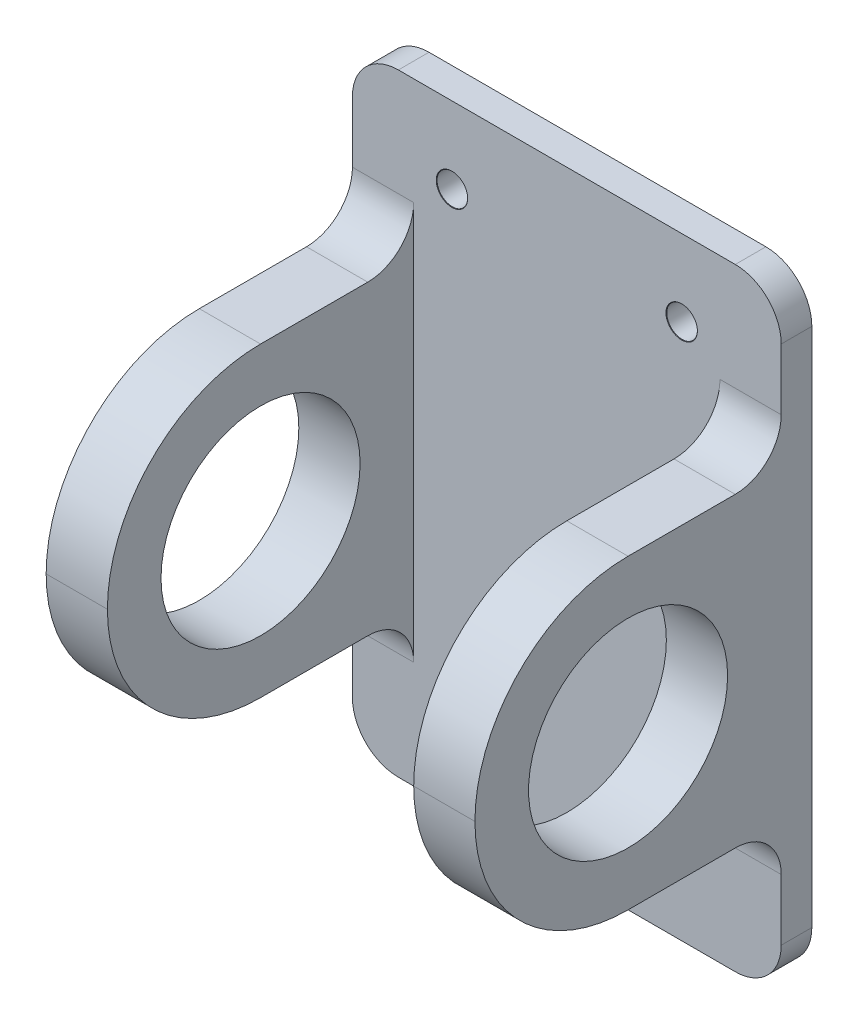
ISO-10303-21;
HEADER;
FILE_DESCRIPTION(('STEP AP214'),'2;1');
FILE_NAME('part.step','',(''),(''),'','','');
FILE_SCHEMA(('AUTOMOTIVE_DESIGN { 1 0 10303 214 1 1 1 1 }'));
ENDSEC;
DATA;
#1=APPLICATION_CONTEXT('core data for automotive mechanical design processes');
#2=APPLICATION_PROTOCOL_DEFINITION('international standard','automotive_design',2000,#1);
#3=PRODUCT_CONTEXT('',#1,'mechanical');
#4=PRODUCT('Part','Part','',(#3));
#5=PRODUCT_RELATED_PRODUCT_CATEGORY('part','',(#4));
#6=PRODUCT_DEFINITION_FORMATION('','',#4);
#7=PRODUCT_DEFINITION_CONTEXT('part definition',#1,'design');
#8=PRODUCT_DEFINITION('design','',#6,#7);
#9=PRODUCT_DEFINITION_SHAPE('','',#8);
#10=(LENGTH_UNIT() NAMED_UNIT(*) SI_UNIT(.MILLI.,.METRE.));
#11=(NAMED_UNIT(*) PLANE_ANGLE_UNIT() SI_UNIT($,.RADIAN.));
#12=(NAMED_UNIT(*) SI_UNIT($,.STERADIAN.) SOLID_ANGLE_UNIT());
#13=UNCERTAINTY_MEASURE_WITH_UNIT(LENGTH_MEASURE(1.E-05),#10,'distance_accuracy_value','');
#14=(GEOMETRIC_REPRESENTATION_CONTEXT(3) GLOBAL_UNCERTAINTY_ASSIGNED_CONTEXT((#13)) GLOBAL_UNIT_ASSIGNED_CONTEXT((#10,
#11,#12)) REPRESENTATION_CONTEXT('',''));
#15=CARTESIAN_POINT('',(0.,0.,0.));
#16=DIRECTION('',(0.,0.,1.));
#17=DIRECTION('',(1.,0.,0.));
#18=AXIS2_PLACEMENT_3D('',#15,#16,#17);
#19=CARTESIAN_POINT('',(0.,0.,0.));
#20=DIRECTION('',(0.,0.,1.));
#21=DIRECTION('',(1.,0.,0.));
#22=AXIS2_PLACEMENT_3D('',#19,#20,#21);
#23=PLANE('',#22);
#24=CARTESIAN_POINT('',(-7.5,-15.,0.));
#25=DIRECTION('',(0.,0.,1.));
#26=DIRECTION('',(1.,0.,0.));
#27=AXIS2_PLACEMENT_3D('',#24,#25,#26);
#28=CIRCLE('',#27,1.025);
#29=CARTESIAN_POINT('',(-6.475,-15.,0.));
#30=VERTEX_POINT('',#29);
#31=EDGE_CURVE('E411',#30,#30,#28,.T.);
#32=ORIENTED_EDGE('',*,*,#31,.F.);
#33=EDGE_LOOP('',(#32));
#34=FACE_BOUND('',#33,.T.);
#35=CARTESIAN_POINT('',(7.5,-15.,0.));
#36=DIRECTION('',(0.,0.,1.));
#37=DIRECTION('',(1.,0.,0.));
#38=AXIS2_PLACEMENT_3D('',#35,#36,#37);
#39=CIRCLE('',#38,1.025);
#40=CARTESIAN_POINT('',(8.525,-15.,0.));
#41=VERTEX_POINT('',#40);
#42=EDGE_CURVE('E407',#41,#41,#39,.T.);
#43=ORIENTED_EDGE('',*,*,#42,.F.);
#44=EDGE_LOOP('',(#43));
#45=FACE_BOUND('',#44,.T.);
#46=CARTESIAN_POINT('',(-7.5,15.,0.));
#47=DIRECTION('',(0.,0.,1.));
#48=DIRECTION('',(1.,0.,0.));
#49=AXIS2_PLACEMENT_3D('',#46,#47,#48);
#50=CIRCLE('',#49,1.025);
#51=CARTESIAN_POINT('',(-6.475,15.,0.));
#52=VERTEX_POINT('',#51);
#53=EDGE_CURVE('E400',#52,#52,#50,.T.);
#54=ORIENTED_EDGE('',*,*,#53,.F.);
#55=EDGE_LOOP('',(#54));
#56=FACE_BOUND('',#55,.T.);
#57=CARTESIAN_POINT('',(7.5,15.,0.));
#58=DIRECTION('',(0.,0.,1.));
#59=DIRECTION('',(1.,0.,0.));
#60=AXIS2_PLACEMENT_3D('',#57,#58,#59);
#61=CIRCLE('',#60,1.025);
#62=CARTESIAN_POINT('',(8.525,15.,0.));
#63=VERTEX_POINT('',#62);
#64=EDGE_CURVE('E389',#63,#63,#61,.T.);
#65=ORIENTED_EDGE('',*,*,#64,.F.);
#66=EDGE_LOOP('',(#65));
#67=FACE_BOUND('',#66,.T.);
#68=DIRECTION('',(0.,-1.,0.));
#69=VECTOR('',#68,1.);
#70=CARTESIAN_POINT('',(-14.,-20.,0.));
#71=LINE('',#70,#69);
#72=CARTESIAN_POINT('',(-14.,-13.,0.));
#73=VERTEX_POINT('',#72);
#74=CARTESIAN_POINT('',(-14.,-17.,0.));
#75=VERTEX_POINT('',#74);
#76=EDGE_CURVE('E224',#73,#75,#71,.T.);
#77=ORIENTED_EDGE('',*,*,#76,.T.);
#78=CARTESIAN_POINT('',(-11.,-17.,0.));
#79=DIRECTION('',(0.,0.,1.));
#80=DIRECTION('',(1.,0.,0.));
#81=AXIS2_PLACEMENT_3D('',#78,#79,#80);
#82=CIRCLE('',#81,3.);
#83=CARTESIAN_POINT('',(-11.,-20.,0.));
#84=VERTEX_POINT('',#83);
#85=EDGE_CURVE('E277',#75,#84,#82,.T.);
#86=ORIENTED_EDGE('',*,*,#85,.T.);
#87=DIRECTION('',(1.,0.,0.));
#88=VECTOR('',#87,1.);
#89=CARTESIAN_POINT('',(-14.,-20.,0.));
#90=LINE('',#89,#88);
#91=CARTESIAN_POINT('',(11.,-20.,0.));
#92=VERTEX_POINT('',#91);
#93=EDGE_CURVE('E347',#84,#92,#90,.T.);
#94=ORIENTED_EDGE('',*,*,#93,.T.);
#95=CARTESIAN_POINT('',(11.,-17.,0.));
#96=DIRECTION('',(0.,0.,1.));
#97=DIRECTION('',(1.,0.,0.));
#98=AXIS2_PLACEMENT_3D('',#95,#96,#97);
#99=CIRCLE('',#98,3.);
#100=CARTESIAN_POINT('',(14.,-17.,0.));
#101=VERTEX_POINT('',#100);
#102=EDGE_CURVE('E269',#92,#101,#99,.T.);
#103=ORIENTED_EDGE('',*,*,#102,.T.);
#104=DIRECTION('',(0.,1.,0.));
#105=VECTOR('',#104,1.);
#106=CARTESIAN_POINT('',(14.,-20.,0.));
#107=LINE('',#106,#105);
#108=CARTESIAN_POINT('',(14.,-13.,0.));
#109=VERTEX_POINT('',#108);
#110=EDGE_CURVE('E342',#101,#109,#107,.T.);
#111=ORIENTED_EDGE('',*,*,#110,.T.);
#112=DIRECTION('',(1.,0.,0.));
#113=VECTOR('',#112,1.);
#114=CARTESIAN_POINT('',(0.,-13.,0.));
#115=LINE('',#114,#113);
#116=CARTESIAN_POINT('',(9.99999999999999,-13.,0.));
#117=VERTEX_POINT('',#116);
#118=EDGE_CURVE('E263',#109,#117,#115,.F.);
#119=ORIENTED_EDGE('',*,*,#118,.T.);
#120=DIRECTION('',(0.,1.,0.));
#121=VECTOR('',#120,1.);
#122=CARTESIAN_POINT('',(9.99999999999999,0.,0.));
#123=LINE('',#122,#121);
#124=CARTESIAN_POINT('',(9.99999999999999,13.,0.));
#125=VERTEX_POINT('',#124);
#126=EDGE_CURVE('E214',#117,#125,#123,.T.);
#127=ORIENTED_EDGE('',*,*,#126,.T.);
#128=DIRECTION('',(1.,0.,0.));
#129=VECTOR('',#128,1.);
#130=CARTESIAN_POINT('',(14.,13.,0.));
#131=LINE('',#130,#129);
#132=CARTESIAN_POINT('',(14.,13.,0.));
#133=VERTEX_POINT('',#132);
#134=EDGE_CURVE('E270',#125,#133,#131,.T.);
#135=ORIENTED_EDGE('',*,*,#134,.T.);
#136=CARTESIAN_POINT('',(14.,17.,0.));
#137=VERTEX_POINT('',#136);
#138=EDGE_CURVE('E341',#133,#137,#107,.T.);
#139=ORIENTED_EDGE('',*,*,#138,.T.);
#140=CARTESIAN_POINT('',(11.,17.,0.));
#141=DIRECTION('',(0.,0.,1.));
#142=DIRECTION('',(1.,0.,0.));
#143=AXIS2_PLACEMENT_3D('',#140,#141,#142);
#144=CIRCLE('',#143,3.);
#145=CARTESIAN_POINT('',(11.,20.,0.));
#146=VERTEX_POINT('',#145);
#147=EDGE_CURVE('E275',#137,#146,#144,.T.);
#148=ORIENTED_EDGE('',*,*,#147,.T.);
#149=DIRECTION('',(-1.,0.,0.));
#150=VECTOR('',#149,1.);
#151=CARTESIAN_POINT('',(-14.,20.,0.));
#152=LINE('',#151,#150);
#153=CARTESIAN_POINT('',(-11.,20.,0.));
#154=VERTEX_POINT('',#153);
#155=EDGE_CURVE('E340',#146,#154,#152,.T.);
#156=ORIENTED_EDGE('',*,*,#155,.T.);
#157=CARTESIAN_POINT('',(-11.,17.,0.));
#158=DIRECTION('',(0.,0.,1.));
#159=DIRECTION('',(1.,0.,0.));
#160=AXIS2_PLACEMENT_3D('',#157,#158,#159);
#161=CIRCLE('',#160,3.);
#162=CARTESIAN_POINT('',(-14.,17.,0.));
#163=VERTEX_POINT('',#162);
#164=EDGE_CURVE('E274',#154,#163,#161,.T.);
#165=ORIENTED_EDGE('',*,*,#164,.T.);
#166=CARTESIAN_POINT('',(-14.,13.,0.));
#167=VERTEX_POINT('',#166);
#168=EDGE_CURVE('E337',#163,#167,#71,.T.);
#169=ORIENTED_EDGE('',*,*,#168,.T.);
#170=DIRECTION('',(1.,0.,0.));
#171=VECTOR('',#170,1.);
#172=CARTESIAN_POINT('',(-10.,13.,0.));
#173=LINE('',#172,#171);
#174=CARTESIAN_POINT('',(-10.,13.,0.));
#175=VERTEX_POINT('',#174);
#176=EDGE_CURVE('E265',#167,#175,#173,.T.);
#177=ORIENTED_EDGE('',*,*,#176,.T.);
#178=DIRECTION('',(0.,1.,0.));
#179=VECTOR('',#178,1.);
#180=CARTESIAN_POINT('',(-10.,0.,0.));
#181=LINE('',#180,#179);
#182=CARTESIAN_POINT('',(-10.,-13.,0.));
#183=VERTEX_POINT('',#182);
#184=EDGE_CURVE('E324',#183,#175,#181,.T.);
#185=ORIENTED_EDGE('',*,*,#184,.F.);
#186=DIRECTION('',(1.,0.,0.));
#187=VECTOR('',#186,1.);
#188=CARTESIAN_POINT('',(0.,-13.,0.));
#189=LINE('',#188,#187);
#190=EDGE_CURVE('E256',#183,#73,#189,.F.);
#191=ORIENTED_EDGE('',*,*,#190,.T.);
#192=EDGE_LOOP('',(#77,#86,#94,#103,#111,#119,#127,#135,#139,#148,#156,#165,#169,#177,#185,#191));
#193=FACE_BOUND('',#192,.T.);
#194=ADVANCED_FACE('F41',(#34,#45,#56,#67,#193),#23,.T.);
#195=CARTESIAN_POINT('',(-14.,-20.,-2.));
#196=DIRECTION('',(0.,-1.,0.));
#197=DIRECTION('',(0.,0.,-1.));
#198=AXIS2_PLACEMENT_3D('',#195,#196,#197);
#199=PLANE('',#198);
#200=ORIENTED_EDGE('',*,*,#93,.F.);
#201=DIRECTION('',(0.,0.,1.));
#202=VECTOR('',#201,1.);
#203=CARTESIAN_POINT('',(-11.,-20.,-2.));
#204=LINE('',#203,#202);
#205=CARTESIAN_POINT('',(-11.,-20.,-2.));
#206=VERTEX_POINT('',#205);
#207=EDGE_CURVE('E283',#84,#206,#204,.F.);
#208=ORIENTED_EDGE('',*,*,#207,.T.);
#209=DIRECTION('',(1.,0.,0.));
#210=VECTOR('',#209,1.);
#211=CARTESIAN_POINT('',(-14.,-20.,-2.));
#212=LINE('',#211,#210);
#213=CARTESIAN_POINT('',(11.,-20.,-2.));
#214=VERTEX_POINT('',#213);
#215=EDGE_CURVE('E339',#206,#214,#212,.T.);
#216=ORIENTED_EDGE('',*,*,#215,.T.);
#217=DIRECTION('',(0.,0.,1.));
#218=VECTOR('',#217,1.);
#219=CARTESIAN_POINT('',(11.,-20.,-2.));
#220=LINE('',#219,#218);
#221=EDGE_CURVE('E279',#214,#92,#220,.T.);
#222=ORIENTED_EDGE('',*,*,#221,.T.);
#223=EDGE_LOOP('',(#200,#208,#216,#222));
#224=FACE_BOUND('',#223,.T.);
#225=ADVANCED_FACE('F421',(#224),#199,.T.);
#226=CARTESIAN_POINT('',(-14.,-20.,-2.));
#227=DIRECTION('',(-1.,0.,0.));
#228=DIRECTION('',(0.,-1.,0.));
#229=AXIS2_PLACEMENT_3D('',#226,#227,#228);
#230=PLANE('',#229);
#231=CARTESIAN_POINT('',(-14.,0.,10.));
#232=DIRECTION('',(1.,0.,0.));
#233=DIRECTION('',(0.,0.,-1.));
#234=AXIS2_PLACEMENT_3D('',#231,#232,#233);
#235=CIRCLE('',#234,6.49999999999999);
#236=CARTESIAN_POINT('',(-14.,0.,3.50000000000001));
#237=VERTEX_POINT('',#236);
#238=EDGE_CURVE('E251',#237,#237,#235,.T.);
#239=ORIENTED_EDGE('',*,*,#238,.T.);
#240=EDGE_LOOP('',(#239));
#241=FACE_BOUND('',#240,.T.);
#242=DIRECTION('',(0.,-1.,0.));
#243=VECTOR('',#242,1.);
#244=CARTESIAN_POINT('',(-14.,-20.,-2.));
#245=LINE('',#244,#243);
#246=CARTESIAN_POINT('',(-14.,17.,-2.));
#247=VERTEX_POINT('',#246);
#248=CARTESIAN_POINT('',(-14.,-17.,-2.));
#249=VERTEX_POINT('',#248);
#250=EDGE_CURVE('E217',#247,#249,#245,.T.);
#251=ORIENTED_EDGE('',*,*,#250,.T.);
#252=DIRECTION('',(0.,0.,1.));
#253=VECTOR('',#252,1.);
#254=CARTESIAN_POINT('',(-14.,-17.,-2.));
#255=LINE('',#254,#253);
#256=EDGE_CURVE('E257',#249,#75,#255,.T.);
#257=ORIENTED_EDGE('',*,*,#256,.T.);
#258=ORIENTED_EDGE('',*,*,#76,.F.);
#259=CARTESIAN_POINT('',(-14.,-13.,3.));
#260=DIRECTION('',(-1.,0.,0.));
#261=DIRECTION('',(0.,-1.,0.));
#262=AXIS2_PLACEMENT_3D('',#259,#260,#261);
#263=CIRCLE('',#262,3.);
#264=CARTESIAN_POINT('',(-14.,-10.,3.));
#265=VERTEX_POINT('',#264);
#266=EDGE_CURVE('E11',#73,#265,#263,.F.);
#267=ORIENTED_EDGE('',*,*,#266,.T.);
#268=DIRECTION('',(0.,0.,-1.));
#269=VECTOR('',#268,1.);
#270=CARTESIAN_POINT('',(-14.,-10.,20.));
#271=LINE('',#270,#269);
#272=CARTESIAN_POINT('',(-14.,-10.,10.));
#273=VERTEX_POINT('',#272);
#274=EDGE_CURVE('E375',#273,#265,#271,.T.);
#275=ORIENTED_EDGE('',*,*,#274,.F.);
#276=CARTESIAN_POINT('',(-14.,0.,10.));
#277=DIRECTION('',(-1.,0.,0.));
#278=DIRECTION('',(0.,-1.,0.));
#279=AXIS2_PLACEMENT_3D('',#276,#277,#278);
#280=CIRCLE('',#279,10.);
#281=CARTESIAN_POINT('',(-14.,0.,20.));
#282=VERTEX_POINT('',#281);
#283=EDGE_CURVE('E238',#273,#282,#280,.T.);
#284=ORIENTED_EDGE('',*,*,#283,.T.);
#285=CARTESIAN_POINT('',(-14.,0.,10.));
#286=DIRECTION('',(-1.,0.,0.));
#287=DIRECTION('',(0.,-1.,0.));
#288=AXIS2_PLACEMENT_3D('',#285,#286,#287);
#289=CIRCLE('',#288,10.);
#290=CARTESIAN_POINT('',(-14.,10.,10.));
#291=VERTEX_POINT('',#290);
#292=EDGE_CURVE('E239',#282,#291,#289,.T.);
#293=ORIENTED_EDGE('',*,*,#292,.T.);
#294=DIRECTION('',(0.,0.,-1.));
#295=VECTOR('',#294,1.);
#296=CARTESIAN_POINT('',(-14.,10.,20.));
#297=LINE('',#296,#295);
#298=CARTESIAN_POINT('',(-14.,10.,3.));
#299=VERTEX_POINT('',#298);
#300=EDGE_CURVE('E367',#291,#299,#297,.T.);
#301=ORIENTED_EDGE('',*,*,#300,.T.);
#302=CARTESIAN_POINT('',(-14.,13.,3.));
#303=DIRECTION('',(-1.,0.,0.));
#304=DIRECTION('',(0.,-1.,0.));
#305=AXIS2_PLACEMENT_3D('',#302,#303,#304);
#306=CIRCLE('',#305,3.);
#307=EDGE_CURVE('E314',#299,#167,#306,.F.);
#308=ORIENTED_EDGE('',*,*,#307,.T.);
#309=ORIENTED_EDGE('',*,*,#168,.F.);
#310=DIRECTION('',(0.,0.,1.));
#311=VECTOR('',#310,1.);
#312=CARTESIAN_POINT('',(-14.,17.,-2.));
#313=LINE('',#312,#311);
#314=EDGE_CURVE('E242',#163,#247,#313,.F.);
#315=ORIENTED_EDGE('',*,*,#314,.T.);
#316=EDGE_LOOP('',(#251,#257,#258,#267,#275,#284,#293,#301,#308,#309,#315));
#317=FACE_BOUND('',#316,.T.);
#318=ADVANCED_FACE('F335',(#241,#317),#230,.T.);
#319=CARTESIAN_POINT('',(-14.,20.,-2.));
#320=DIRECTION('',(0.,1.,0.));
#321=DIRECTION('',(0.,0.,1.));
#322=AXIS2_PLACEMENT_3D('',#319,#320,#321);
#323=PLANE('',#322);
#324=DIRECTION('',(-1.,0.,0.));
#325=VECTOR('',#324,1.);
#326=CARTESIAN_POINT('',(-14.,20.,-2.));
#327=LINE('',#326,#325);
#328=CARTESIAN_POINT('',(11.,20.,-2.));
#329=VERTEX_POINT('',#328);
#330=CARTESIAN_POINT('',(-11.,20.,-2.));
#331=VERTEX_POINT('',#330);
#332=EDGE_CURVE('E225',#329,#331,#327,.T.);
#333=ORIENTED_EDGE('',*,*,#332,.T.);
#334=DIRECTION('',(0.,0.,1.));
#335=VECTOR('',#334,1.);
#336=CARTESIAN_POINT('',(-11.,20.,-2.));
#337=LINE('',#336,#335);
#338=EDGE_CURVE('E291',#331,#154,#337,.T.);
#339=ORIENTED_EDGE('',*,*,#338,.T.);
#340=ORIENTED_EDGE('',*,*,#155,.F.);
#341=DIRECTION('',(0.,0.,1.));
#342=VECTOR('',#341,1.);
#343=CARTESIAN_POINT('',(11.,20.,-2.));
#344=LINE('',#343,#342);
#345=EDGE_CURVE('E293',#146,#329,#344,.F.);
#346=ORIENTED_EDGE('',*,*,#345,.T.);
#347=EDGE_LOOP('',(#333,#339,#340,#346));
#348=FACE_BOUND('',#347,.T.);
#349=ADVANCED_FACE('F485',(#348),#323,.T.);
#350=CARTESIAN_POINT('',(14.,-20.,-2.));
#351=DIRECTION('',(1.,0.,0.));
#352=DIRECTION('',(0.,1.,0.));
#353=AXIS2_PLACEMENT_3D('',#350,#351,#352);
#354=PLANE('',#353);
#355=CARTESIAN_POINT('',(14.,0.,10.));
#356=DIRECTION('',(1.,0.,0.));
#357=DIRECTION('',(0.,0.,-1.));
#358=AXIS2_PLACEMENT_3D('',#355,#356,#357);
#359=CIRCLE('',#358,6.5);
#360=CARTESIAN_POINT('',(14.,0.,3.5));
#361=VERTEX_POINT('',#360);
#362=EDGE_CURVE('E378',#361,#361,#359,.T.);
#363=ORIENTED_EDGE('',*,*,#362,.F.);
#364=EDGE_LOOP('',(#363));
#365=FACE_BOUND('',#364,.T.);
#366=DIRECTION('',(0.,1.,0.));
#367=VECTOR('',#366,1.);
#368=CARTESIAN_POINT('',(14.,-20.,-2.));
#369=LINE('',#368,#367);
#370=CARTESIAN_POINT('',(14.,-17.,-2.));
#371=VERTEX_POINT('',#370);
#372=CARTESIAN_POINT('',(14.,17.,-2.));
#373=VERTEX_POINT('',#372);
#374=EDGE_CURVE('E351',#371,#373,#369,.T.);
#375=ORIENTED_EDGE('',*,*,#374,.T.);
#376=DIRECTION('',(0.,0.,1.));
#377=VECTOR('',#376,1.);
#378=CARTESIAN_POINT('',(14.,17.,-2.));
#379=LINE('',#378,#377);
#380=EDGE_CURVE('E296',#373,#137,#379,.T.);
#381=ORIENTED_EDGE('',*,*,#380,.T.);
#382=ORIENTED_EDGE('',*,*,#138,.F.);
#383=CARTESIAN_POINT('',(14.,13.,3.));
#384=DIRECTION('',(1.,0.,0.));
#385=DIRECTION('',(0.,1.,0.));
#386=AXIS2_PLACEMENT_3D('',#383,#384,#385);
#387=CIRCLE('',#386,3.);
#388=CARTESIAN_POINT('',(14.,10.,3.));
#389=VERTEX_POINT('',#388);
#390=EDGE_CURVE('E307',#133,#389,#387,.F.);
#391=ORIENTED_EDGE('',*,*,#390,.T.);
#392=DIRECTION('',(0.,0.,-1.));
#393=VECTOR('',#392,1.);
#394=CARTESIAN_POINT('',(14.,10.,20.));
#395=LINE('',#394,#393);
#396=CARTESIAN_POINT('',(14.,10.,10.));
#397=VERTEX_POINT('',#396);
#398=EDGE_CURVE('E215',#397,#389,#395,.T.);
#399=ORIENTED_EDGE('',*,*,#398,.F.);
#400=CARTESIAN_POINT('',(14.,0.,10.));
#401=DIRECTION('',(1.,0.,0.));
#402=DIRECTION('',(0.,1.,0.));
#403=AXIS2_PLACEMENT_3D('',#400,#401,#402);
#404=CIRCLE('',#403,10.);
#405=CARTESIAN_POINT('',(14.,0.,20.));
#406=VERTEX_POINT('',#405);
#407=EDGE_CURVE('E218',#397,#406,#404,.T.);
#408=ORIENTED_EDGE('',*,*,#407,.T.);
#409=CARTESIAN_POINT('',(14.,0.,10.));
#410=DIRECTION('',(1.,0.,0.));
#411=DIRECTION('',(0.,1.,0.));
#412=AXIS2_PLACEMENT_3D('',#409,#410,#411);
#413=CIRCLE('',#412,10.);
#414=CARTESIAN_POINT('',(14.,-9.99999999999999,10.));
#415=VERTEX_POINT('',#414);
#416=EDGE_CURVE('E219',#406,#415,#413,.T.);
#417=ORIENTED_EDGE('',*,*,#416,.T.);
#418=DIRECTION('',(0.,0.,-1.));
#419=VECTOR('',#418,1.);
#420=CARTESIAN_POINT('',(14.,-9.99999999999999,20.));
#421=LINE('',#420,#419);
#422=CARTESIAN_POINT('',(14.,-9.99999999999999,3.));
#423=VERTEX_POINT('',#422);
#424=EDGE_CURVE('E359',#415,#423,#421,.T.);
#425=ORIENTED_EDGE('',*,*,#424,.T.);
#426=CARTESIAN_POINT('',(14.,-13.,3.));
#427=DIRECTION('',(1.,0.,0.));
#428=DIRECTION('',(0.,1.,0.));
#429=AXIS2_PLACEMENT_3D('',#426,#427,#428);
#430=CIRCLE('',#429,3.);
#431=EDGE_CURVE('E320',#423,#109,#430,.F.);
#432=ORIENTED_EDGE('',*,*,#431,.T.);
#433=ORIENTED_EDGE('',*,*,#110,.F.);
#434=DIRECTION('',(0.,0.,1.));
#435=VECTOR('',#434,1.);
#436=CARTESIAN_POINT('',(14.,-17.,-2.));
#437=LINE('',#436,#435);
#438=EDGE_CURVE('E298',#101,#371,#437,.F.);
#439=ORIENTED_EDGE('',*,*,#438,.T.);
#440=EDGE_LOOP('',(#375,#381,#382,#391,#399,#408,#417,#425,#432,#433,#439));
#441=FACE_BOUND('',#440,.T.);
#442=ADVANCED_FACE('F479',(#365,#441),#354,.T.);
#443=CARTESIAN_POINT('',(0.,0.,-2.));
#444=DIRECTION('',(0.,0.,1.));
#445=DIRECTION('',(1.,0.,0.));
#446=AXIS2_PLACEMENT_3D('',#443,#444,#445);
#447=PLANE('',#446);
#448=CARTESIAN_POINT('',(-7.5,-15.,-2.));
#449=DIRECTION('',(0.,0.,1.));
#450=DIRECTION('',(1.,0.,0.));
#451=AXIS2_PLACEMENT_3D('',#448,#449,#450);
#452=CIRCLE('',#451,1.);
#453=CARTESIAN_POINT('',(-6.5,-15.,-2.));
#454=VERTEX_POINT('',#453);
#455=EDGE_CURVE('E406',#454,#454,#452,.T.);
#456=ORIENTED_EDGE('',*,*,#455,.T.);
#457=EDGE_LOOP('',(#456));
#458=FACE_BOUND('',#457,.T.);
#459=CARTESIAN_POINT('',(7.5,-15.,-2.));
#460=DIRECTION('',(0.,0.,1.));
#461=DIRECTION('',(1.,0.,0.));
#462=AXIS2_PLACEMENT_3D('',#459,#460,#461);
#463=CIRCLE('',#462,1.);
#464=CARTESIAN_POINT('',(8.5,-15.,-2.));
#465=VERTEX_POINT('',#464);
#466=EDGE_CURVE('E399',#465,#465,#463,.T.);
#467=ORIENTED_EDGE('',*,*,#466,.T.);
#468=EDGE_LOOP('',(#467));
#469=FACE_BOUND('',#468,.T.);
#470=CARTESIAN_POINT('',(-7.5,15.,-2.));
#471=DIRECTION('',(0.,0.,1.));
#472=DIRECTION('',(1.,0.,0.));
#473=AXIS2_PLACEMENT_3D('',#470,#471,#472);
#474=CIRCLE('',#473,1.);
#475=CARTESIAN_POINT('',(-6.5,15.,-2.));
#476=VERTEX_POINT('',#475);
#477=EDGE_CURVE('E393',#476,#476,#474,.T.);
#478=ORIENTED_EDGE('',*,*,#477,.T.);
#479=EDGE_LOOP('',(#478));
#480=FACE_BOUND('',#479,.T.);
#481=CARTESIAN_POINT('',(7.5,15.,-2.));
#482=DIRECTION('',(0.,0.,1.));
#483=DIRECTION('',(1.,0.,0.));
#484=AXIS2_PLACEMENT_3D('',#481,#482,#483);
#485=CIRCLE('',#484,1.);
#486=CARTESIAN_POINT('',(8.5,15.,-2.));
#487=VERTEX_POINT('',#486);
#488=EDGE_CURVE('E385',#487,#487,#485,.T.);
#489=ORIENTED_EDGE('',*,*,#488,.T.);
#490=EDGE_LOOP('',(#489));
#491=FACE_BOUND('',#490,.T.);
#492=ORIENTED_EDGE('',*,*,#215,.F.);
#493=CARTESIAN_POINT('',(-11.,-17.,-2.));
#494=DIRECTION('',(0.,0.,1.));
#495=DIRECTION('',(1.,0.,0.));
#496=AXIS2_PLACEMENT_3D('',#493,#494,#495);
#497=CIRCLE('',#496,3.);
#498=EDGE_CURVE('E287',#206,#249,#497,.F.);
#499=ORIENTED_EDGE('',*,*,#498,.T.);
#500=ORIENTED_EDGE('',*,*,#250,.F.);
#501=CARTESIAN_POINT('',(-11.,17.,-2.));
#502=DIRECTION('',(0.,0.,1.));
#503=DIRECTION('',(1.,0.,0.));
#504=AXIS2_PLACEMENT_3D('',#501,#502,#503);
#505=CIRCLE('',#504,3.);
#506=EDGE_CURVE('E290',#247,#331,#505,.F.);
#507=ORIENTED_EDGE('',*,*,#506,.T.);
#508=ORIENTED_EDGE('',*,*,#332,.F.);
#509=CARTESIAN_POINT('',(11.,17.,-2.));
#510=DIRECTION('',(0.,0.,1.));
#511=DIRECTION('',(1.,0.,0.));
#512=AXIS2_PLACEMENT_3D('',#509,#510,#511);
#513=CIRCLE('',#512,3.);
#514=EDGE_CURVE('E281',#329,#373,#513,.F.);
#515=ORIENTED_EDGE('',*,*,#514,.T.);
#516=ORIENTED_EDGE('',*,*,#374,.F.);
#517=CARTESIAN_POINT('',(11.,-17.,-2.));
#518=DIRECTION('',(0.,0.,1.));
#519=DIRECTION('',(1.,0.,0.));
#520=AXIS2_PLACEMENT_3D('',#517,#518,#519);
#521=CIRCLE('',#520,3.);
#522=EDGE_CURVE('E282',#371,#214,#521,.F.);
#523=ORIENTED_EDGE('',*,*,#522,.T.);
#524=EDGE_LOOP('',(#492,#499,#500,#507,#508,#515,#516,#523));
#525=FACE_BOUND('',#524,.T.);
#526=ADVANCED_FACE('F471',(#458,#469,#480,#491,#525),#447,.F.);
#527=CARTESIAN_POINT('',(9.99999999999999,0.,20.));
#528=DIRECTION('',(-1.,0.,0.));
#529=DIRECTION('',(0.,-1.,0.));
#530=AXIS2_PLACEMENT_3D('',#527,#528,#529);
#531=PLANE('',#530);
#532=CARTESIAN_POINT('',(9.99999999999999,0.,10.));
#533=DIRECTION('',(-1.,0.,0.));
#534=DIRECTION('',(0.,-1.,0.));
#535=AXIS2_PLACEMENT_3D('',#532,#533,#534);
#536=CIRCLE('',#535,6.5);
#537=CARTESIAN_POINT('',(9.99999999999999,-6.49999999999999,10.));
#538=VERTEX_POINT('',#537);
#539=EDGE_CURVE('E249',#538,#538,#536,.T.);
#540=ORIENTED_EDGE('',*,*,#539,.F.);
#541=EDGE_LOOP('',(#540));
#542=FACE_BOUND('',#541,.T.);
#543=CARTESIAN_POINT('',(9.99999999999999,0.,10.));
#544=DIRECTION('',(-1.,0.,0.));
#545=DIRECTION('',(0.,-1.,0.));
#546=AXIS2_PLACEMENT_3D('',#543,#544,#545);
#547=CIRCLE('',#546,10.);
#548=CARTESIAN_POINT('',(9.99999999999999,-9.99999999999999,10.));
#549=VERTEX_POINT('',#548);
#550=CARTESIAN_POINT('',(9.99999999999999,0.,20.));
#551=VERTEX_POINT('',#550);
#552=EDGE_CURVE('E199',#549,#551,#547,.T.);
#553=ORIENTED_EDGE('',*,*,#552,.T.);
#554=CARTESIAN_POINT('',(9.99999999999999,0.,10.));
#555=DIRECTION('',(-1.,0.,0.));
#556=DIRECTION('',(0.,-1.,0.));
#557=AXIS2_PLACEMENT_3D('',#554,#555,#556);
#558=CIRCLE('',#557,10.);
#559=CARTESIAN_POINT('',(9.99999999999999,10.,10.));
#560=VERTEX_POINT('',#559);
#561=EDGE_CURVE('E188',#551,#560,#558,.T.);
#562=ORIENTED_EDGE('',*,*,#561,.T.);
#563=DIRECTION('',(0.,0.,-1.));
#564=VECTOR('',#563,1.);
#565=CARTESIAN_POINT('',(9.99999999999999,10.,20.));
#566=LINE('',#565,#564);
#567=CARTESIAN_POINT('',(9.99999999999999,10.,3.));
#568=VERTEX_POINT('',#567);
#569=EDGE_CURVE('E191',#560,#568,#566,.T.);
#570=ORIENTED_EDGE('',*,*,#569,.T.);
#571=CARTESIAN_POINT('',(9.99999999999999,13.,3.));
#572=DIRECTION('',(-1.,0.,0.));
#573=DIRECTION('',(0.,-1.,0.));
#574=AXIS2_PLACEMENT_3D('',#571,#572,#573);
#575=CIRCLE('',#574,3.);
#576=EDGE_CURVE('E311',#568,#125,#575,.F.);
#577=ORIENTED_EDGE('',*,*,#576,.T.);
#578=ORIENTED_EDGE('',*,*,#126,.F.);
#579=CARTESIAN_POINT('',(9.99999999999999,-13.,3.));
#580=DIRECTION('',(-1.,0.,0.));
#581=DIRECTION('',(0.,-1.,0.));
#582=AXIS2_PLACEMENT_3D('',#579,#580,#581);
#583=CIRCLE('',#582,3.);
#584=CARTESIAN_POINT('',(9.99999999999999,-9.99999999999999,3.));
#585=VERTEX_POINT('',#584);
#586=EDGE_CURVE('E64',#117,#585,#583,.F.);
#587=ORIENTED_EDGE('',*,*,#586,.T.);
#588=DIRECTION('',(0.,0.,-1.));
#589=VECTOR('',#588,1.);
#590=CARTESIAN_POINT('',(9.99999999999999,-9.99999999999999,20.));
#591=LINE('',#590,#589);
#592=EDGE_CURVE('E356',#549,#585,#591,.T.);
#593=ORIENTED_EDGE('',*,*,#592,.F.);
#594=EDGE_LOOP('',(#553,#562,#570,#577,#578,#587,#593));
#595=FACE_BOUND('',#594,.T.);
#596=ADVANCED_FACE('F195',(#542,#595),#531,.T.);
#597=CARTESIAN_POINT('',(0.,-10.,20.));
#598=DIRECTION('',(0.,1.,0.));
#599=DIRECTION('',(-1.,0.,0.));
#600=AXIS2_PLACEMENT_3D('',#597,#598,#599);
#601=PLANE('',#600);
#602=ORIENTED_EDGE('',*,*,#592,.T.);
#603=DIRECTION('',(1.,0.,0.));
#604=VECTOR('',#603,1.);
#605=CARTESIAN_POINT('',(0.,-10.,3.));
#606=LINE('',#605,#604);
#607=EDGE_CURVE('E302',#585,#423,#606,.T.);
#608=ORIENTED_EDGE('',*,*,#607,.T.);
#609=ORIENTED_EDGE('',*,*,#424,.F.);
#610=DIRECTION('',(1.,0.,0.));
#611=VECTOR('',#610,1.);
#612=CARTESIAN_POINT('',(9.99999999999999,-9.99999999999999,10.));
#613=LINE('',#612,#611);
#614=EDGE_CURVE('E205',#415,#549,#613,.F.);
#615=ORIENTED_EDGE('',*,*,#614,.T.);
#616=EDGE_LOOP('',(#602,#608,#609,#615));
#617=FACE_BOUND('',#616,.T.);
#618=ADVANCED_FACE('F466',(#617),#601,.F.);
#619=CARTESIAN_POINT('',(0.,10.,20.));
#620=DIRECTION('',(0.,1.,0.));
#621=DIRECTION('',(-1.,0.,0.));
#622=AXIS2_PLACEMENT_3D('',#619,#620,#621);
#623=PLANE('',#622);
#624=ORIENTED_EDGE('',*,*,#398,.T.);
#625=DIRECTION('',(1.,0.,0.));
#626=VECTOR('',#625,1.);
#627=CARTESIAN_POINT('',(9.99999999999999,10.,3.));
#628=LINE('',#627,#626);
#629=EDGE_CURVE('E212',#389,#568,#628,.F.);
#630=ORIENTED_EDGE('',*,*,#629,.T.);
#631=ORIENTED_EDGE('',*,*,#569,.F.);
#632=DIRECTION('',(1.,0.,0.));
#633=VECTOR('',#632,1.);
#634=CARTESIAN_POINT('',(0.,10.,10.));
#635=LINE('',#634,#633);
#636=EDGE_CURVE('E206',#560,#397,#635,.T.);
#637=ORIENTED_EDGE('',*,*,#636,.T.);
#638=EDGE_LOOP('',(#624,#630,#631,#637));
#639=FACE_BOUND('',#638,.T.);
#640=ADVANCED_FACE('F210',(#639),#623,.T.);
#641=CARTESIAN_POINT('',(0.,-10.,20.));
#642=DIRECTION('',(0.,1.,0.));
#643=DIRECTION('',(-1.,0.,0.));
#644=AXIS2_PLACEMENT_3D('',#641,#642,#643);
#645=PLANE('',#644);
#646=ORIENTED_EDGE('',*,*,#274,.T.);
#647=DIRECTION('',(1.,0.,0.));
#648=VECTOR('',#647,1.);
#649=CARTESIAN_POINT('',(0.,-10.,3.));
#650=LINE('',#649,#648);
#651=CARTESIAN_POINT('',(-10.,-10.,3.));
#652=VERTEX_POINT('',#651);
#653=EDGE_CURVE('E310',#265,#652,#650,.T.);
#654=ORIENTED_EDGE('',*,*,#653,.T.);
#655=DIRECTION('',(0.,0.,-1.));
#656=VECTOR('',#655,1.);
#657=CARTESIAN_POINT('',(-10.,-10.,20.));
#658=LINE('',#657,#656);
#659=CARTESIAN_POINT('',(-10.,-10.,10.));
#660=VERTEX_POINT('',#659);
#661=EDGE_CURVE('E328',#660,#652,#658,.T.);
#662=ORIENTED_EDGE('',*,*,#661,.F.);
#663=DIRECTION('',(1.,0.,0.));
#664=VECTOR('',#663,1.);
#665=CARTESIAN_POINT('',(-14.,-10.,10.));
#666=LINE('',#665,#664);
#667=EDGE_CURVE('E245',#660,#273,#666,.F.);
#668=ORIENTED_EDGE('',*,*,#667,.T.);
#669=EDGE_LOOP('',(#646,#654,#662,#668));
#670=FACE_BOUND('',#669,.T.);
#671=ADVANCED_FACE('F463',(#670),#645,.F.);
#672=CARTESIAN_POINT('',(-10.,0.,20.));
#673=DIRECTION('',(-1.,0.,0.));
#674=DIRECTION('',(0.,-1.,0.));
#675=AXIS2_PLACEMENT_3D('',#672,#673,#674);
#676=PLANE('',#675);
#677=CARTESIAN_POINT('',(-10.,0.,10.));
#678=DIRECTION('',(-1.,0.,0.));
#679=DIRECTION('',(0.,-1.,0.));
#680=AXIS2_PLACEMENT_3D('',#677,#678,#679);
#681=CIRCLE('',#680,6.5);
#682=CARTESIAN_POINT('',(-10.,-6.49999999999999,10.));
#683=VERTEX_POINT('',#682);
#684=EDGE_CURVE('E252',#683,#683,#681,.T.);
#685=ORIENTED_EDGE('',*,*,#684,.T.);
#686=EDGE_LOOP('',(#685));
#687=FACE_BOUND('',#686,.T.);
#688=DIRECTION('',(0.,0.,-1.));
#689=VECTOR('',#688,1.);
#690=CARTESIAN_POINT('',(-10.,10.,20.));
#691=LINE('',#690,#689);
#692=CARTESIAN_POINT('',(-10.,10.,10.));
#693=VERTEX_POINT('',#692);
#694=CARTESIAN_POINT('',(-10.,10.,3.));
#695=VERTEX_POINT('',#694);
#696=EDGE_CURVE('E366',#693,#695,#691,.T.);
#697=ORIENTED_EDGE('',*,*,#696,.F.);
#698=CARTESIAN_POINT('',(-10.,0.,10.));
#699=DIRECTION('',(-1.,0.,0.));
#700=DIRECTION('',(0.,-1.,0.));
#701=AXIS2_PLACEMENT_3D('',#698,#699,#700);
#702=CIRCLE('',#701,10.);
#703=CARTESIAN_POINT('',(-10.,0.,20.));
#704=VERTEX_POINT('',#703);
#705=EDGE_CURVE('E236',#693,#704,#702,.F.);
#706=ORIENTED_EDGE('',*,*,#705,.T.);
#707=CARTESIAN_POINT('',(-10.,0.,10.));
#708=DIRECTION('',(-1.,0.,0.));
#709=DIRECTION('',(0.,-1.,0.));
#710=AXIS2_PLACEMENT_3D('',#707,#708,#709);
#711=CIRCLE('',#710,10.);
#712=EDGE_CURVE('E234',#704,#660,#711,.F.);
#713=ORIENTED_EDGE('',*,*,#712,.T.);
#714=ORIENTED_EDGE('',*,*,#661,.T.);
#715=CARTESIAN_POINT('',(-10.,-13.,3.));
#716=DIRECTION('',(-1.,0.,0.));
#717=DIRECTION('',(0.,-1.,0.));
#718=AXIS2_PLACEMENT_3D('',#715,#716,#717);
#719=CIRCLE('',#718,3.);
#720=EDGE_CURVE('E47',#652,#183,#719,.T.);
#721=ORIENTED_EDGE('',*,*,#720,.T.);
#722=ORIENTED_EDGE('',*,*,#184,.T.);
#723=CARTESIAN_POINT('',(-10.,13.,3.));
#724=DIRECTION('',(-1.,0.,0.));
#725=DIRECTION('',(0.,-1.,0.));
#726=AXIS2_PLACEMENT_3D('',#723,#724,#725);
#727=CIRCLE('',#726,3.);
#728=EDGE_CURVE('E312',#175,#695,#727,.T.);
#729=ORIENTED_EDGE('',*,*,#728,.T.);
#730=EDGE_LOOP('',(#697,#706,#713,#714,#721,#722,#729));
#731=FACE_BOUND('',#730,.T.);
#732=ADVANCED_FACE('F325',(#687,#731),#676,.F.);
#733=CARTESIAN_POINT('',(0.,10.,20.));
#734=DIRECTION('',(0.,1.,0.));
#735=DIRECTION('',(-1.,0.,0.));
#736=AXIS2_PLACEMENT_3D('',#733,#734,#735);
#737=PLANE('',#736);
#738=ORIENTED_EDGE('',*,*,#696,.T.);
#739=DIRECTION('',(1.,0.,0.));
#740=VECTOR('',#739,1.);
#741=CARTESIAN_POINT('',(-14.,10.,3.));
#742=LINE('',#741,#740);
#743=EDGE_CURVE('E305',#695,#299,#742,.F.);
#744=ORIENTED_EDGE('',*,*,#743,.T.);
#745=ORIENTED_EDGE('',*,*,#300,.F.);
#746=DIRECTION('',(1.,0.,0.));
#747=VECTOR('',#746,1.);
#748=CARTESIAN_POINT('',(0.,10.,10.));
#749=LINE('',#748,#747);
#750=EDGE_CURVE('E233',#291,#693,#749,.T.);
#751=ORIENTED_EDGE('',*,*,#750,.T.);
#752=EDGE_LOOP('',(#738,#744,#745,#751));
#753=FACE_BOUND('',#752,.T.);
#754=ADVANCED_FACE('F451',(#753),#737,.T.);
#755=CARTESIAN_POINT('',(0.,0.,10.));
#756=DIRECTION('',(-1.,0.,0.));
#757=DIRECTION('',(0.,-1.,0.));
#758=AXIS2_PLACEMENT_3D('',#755,#756,#757);
#759=CYLINDRICAL_SURFACE('',#758,10.);
#760=DIRECTION('',(1.,0.,0.));
#761=VECTOR('',#760,1.);
#762=CARTESIAN_POINT('',(14.,0.,20.));
#763=LINE('',#762,#761);
#764=EDGE_CURVE('E244',#551,#406,#763,.T.);
#765=ORIENTED_EDGE('',*,*,#764,.F.);
#766=ORIENTED_EDGE('',*,*,#552,.F.);
#767=ORIENTED_EDGE('',*,*,#614,.F.);
#768=ORIENTED_EDGE('',*,*,#416,.F.);
#769=EDGE_LOOP('',(#765,#766,#767,#768));
#770=FACE_BOUND('',#769,.T.);
#771=ADVANCED_FACE('F459',(#770),#759,.T.);
#772=CARTESIAN_POINT('',(0.,0.,10.));
#773=DIRECTION('',(1.,0.,0.));
#774=DIRECTION('',(0.,1.,0.));
#775=AXIS2_PLACEMENT_3D('',#772,#773,#774);
#776=CYLINDRICAL_SURFACE('',#775,10.);
#777=ORIENTED_EDGE('',*,*,#561,.F.);
#778=ORIENTED_EDGE('',*,*,#764,.T.);
#779=ORIENTED_EDGE('',*,*,#407,.F.);
#780=ORIENTED_EDGE('',*,*,#636,.F.);
#781=EDGE_LOOP('',(#777,#778,#779,#780));
#782=FACE_BOUND('',#781,.T.);
#783=ADVANCED_FACE('F213',(#782),#776,.T.);
#784=CARTESIAN_POINT('',(0.,0.,10.));
#785=DIRECTION('',(-1.,0.,0.));
#786=DIRECTION('',(0.,-1.,0.));
#787=AXIS2_PLACEMENT_3D('',#784,#785,#786);
#788=CYLINDRICAL_SURFACE('',#787,10.);
#789=DIRECTION('',(1.,0.,0.));
#790=VECTOR('',#789,1.);
#791=CARTESIAN_POINT('',(-10.,0.,20.));
#792=LINE('',#791,#790);
#793=EDGE_CURVE('E250',#282,#704,#792,.T.);
#794=ORIENTED_EDGE('',*,*,#793,.F.);
#795=ORIENTED_EDGE('',*,*,#283,.F.);
#796=ORIENTED_EDGE('',*,*,#667,.F.);
#797=ORIENTED_EDGE('',*,*,#712,.F.);
#798=EDGE_LOOP('',(#794,#795,#796,#797));
#799=FACE_BOUND('',#798,.T.);
#800=ADVANCED_FACE('F492',(#799),#788,.T.);
#801=CARTESIAN_POINT('',(0.,0.,10.));
#802=DIRECTION('',(1.,0.,0.));
#803=DIRECTION('',(0.,1.,0.));
#804=AXIS2_PLACEMENT_3D('',#801,#802,#803);
#805=CYLINDRICAL_SURFACE('',#804,10.);
#806=ORIENTED_EDGE('',*,*,#292,.F.);
#807=ORIENTED_EDGE('',*,*,#793,.T.);
#808=ORIENTED_EDGE('',*,*,#705,.F.);
#809=ORIENTED_EDGE('',*,*,#750,.F.);
#810=EDGE_LOOP('',(#806,#807,#808,#809));
#811=FACE_BOUND('',#810,.T.);
#812=ADVANCED_FACE('F497',(#811),#805,.T.);
#813=CARTESIAN_POINT('',(14.,0.,10.));
#814=DIRECTION('',(1.,0.,0.));
#815=DIRECTION('',(0.,0.,-1.));
#816=AXIS2_PLACEMENT_3D('',#813,#814,#815);
#817=CYLINDRICAL_SURFACE('',#816,6.5);
#818=ORIENTED_EDGE('',*,*,#238,.F.);
#819=EDGE_LOOP('',(#818));
#820=FACE_BOUND('',#819,.T.);
#821=ORIENTED_EDGE('',*,*,#684,.F.);
#822=EDGE_LOOP('',(#821));
#823=FACE_BOUND('',#822,.T.);
#824=ADVANCED_FACE('F455',(#820,#823),#817,.F.);
#825=ORIENTED_EDGE('',*,*,#539,.T.);
#826=EDGE_LOOP('',(#825));
#827=FACE_BOUND('',#826,.T.);
#828=ORIENTED_EDGE('',*,*,#362,.T.);
#829=EDGE_LOOP('',(#828));
#830=FACE_BOUND('',#829,.T.);
#831=ADVANCED_FACE('F443',(#827,#830),#817,.F.);
#832=CARTESIAN_POINT('',(7.5,15.,0.));
#833=DIRECTION('',(0.,0.,1.));
#834=DIRECTION('',(1.,0.,0.));
#835=AXIS2_PLACEMENT_3D('',#832,#833,#834);
#836=CYLINDRICAL_SURFACE('',#835,1.);
#837=ORIENTED_EDGE('',*,*,#488,.F.);
#838=EDGE_LOOP('',(#837));
#839=FACE_BOUND('',#838,.T.);
#840=CARTESIAN_POINT('',(7.5,15.,-0.024999999999999));
#841=DIRECTION('',(0.,0.,1.));
#842=DIRECTION('',(1.,0.,0.));
#843=AXIS2_PLACEMENT_3D('',#840,#841,#842);
#844=CIRCLE('',#843,1.);
#845=CARTESIAN_POINT('',(8.5,15.,-0.024999999999999));
#846=VERTEX_POINT('',#845);
#847=EDGE_CURVE('E383',#846,#846,#844,.T.);
#848=ORIENTED_EDGE('',*,*,#847,.T.);
#849=EDGE_LOOP('',(#848));
#850=FACE_BOUND('',#849,.T.);
#851=ADVANCED_FACE('F432',(#839,#850),#836,.F.);
#852=CARTESIAN_POINT('',(7.5,15.,0.));
#853=DIRECTION('',(0.,0.,1.));
#854=DIRECTION('',(1.,0.,0.));
#855=AXIS2_PLACEMENT_3D('',#852,#853,#854);
#856=CONICAL_SURFACE('',#855,1.025,0.785398163397431);
#857=ORIENTED_EDGE('',*,*,#847,.F.);
#858=EDGE_LOOP('',(#857));
#859=FACE_BOUND('',#858,.T.);
#860=ORIENTED_EDGE('',*,*,#64,.T.);
#861=EDGE_LOOP('',(#860));
#862=FACE_BOUND('',#861,.T.);
#863=ADVANCED_FACE('F431',(#859,#862),#856,.F.);
#864=CARTESIAN_POINT('',(-7.5,15.,0.));
#865=DIRECTION('',(0.,0.,1.));
#866=DIRECTION('',(1.,0.,0.));
#867=AXIS2_PLACEMENT_3D('',#864,#865,#866);
#868=CYLINDRICAL_SURFACE('',#867,1.);
#869=ORIENTED_EDGE('',*,*,#477,.F.);
#870=EDGE_LOOP('',(#869));
#871=FACE_BOUND('',#870,.T.);
#872=CARTESIAN_POINT('',(-7.5,15.,-0.024999999999999));
#873=DIRECTION('',(0.,0.,1.));
#874=DIRECTION('',(1.,0.,0.));
#875=AXIS2_PLACEMENT_3D('',#872,#873,#874);
#876=CIRCLE('',#875,1.);
#877=CARTESIAN_POINT('',(-6.5,15.,-0.024999999999999));
#878=VERTEX_POINT('',#877);
#879=EDGE_CURVE('E395',#878,#878,#876,.T.);
#880=ORIENTED_EDGE('',*,*,#879,.T.);
#881=EDGE_LOOP('',(#880));
#882=FACE_BOUND('',#881,.T.);
#883=ADVANCED_FACE('F433',(#871,#882),#868,.F.);
#884=CARTESIAN_POINT('',(-7.5,15.,0.));
#885=DIRECTION('',(0.,0.,1.));
#886=DIRECTION('',(1.,0.,0.));
#887=AXIS2_PLACEMENT_3D('',#884,#885,#886);
#888=CONICAL_SURFACE('',#887,1.025,0.785398163397448);
#889=ORIENTED_EDGE('',*,*,#879,.F.);
#890=EDGE_LOOP('',(#889));
#891=FACE_BOUND('',#890,.T.);
#892=ORIENTED_EDGE('',*,*,#53,.T.);
#893=EDGE_LOOP('',(#892));
#894=FACE_BOUND('',#893,.T.);
#895=ADVANCED_FACE('F441',(#891,#894),#888,.F.);
#896=CARTESIAN_POINT('',(7.5,-15.,0.));
#897=DIRECTION('',(0.,0.,1.));
#898=DIRECTION('',(1.,0.,0.));
#899=AXIS2_PLACEMENT_3D('',#896,#897,#898);
#900=CYLINDRICAL_SURFACE('',#899,1.);
#901=ORIENTED_EDGE('',*,*,#466,.F.);
#902=EDGE_LOOP('',(#901));
#903=FACE_BOUND('',#902,.T.);
#904=CARTESIAN_POINT('',(7.5,-15.,-0.024999999999999));
#905=DIRECTION('',(0.,0.,1.));
#906=DIRECTION('',(1.,0.,0.));
#907=AXIS2_PLACEMENT_3D('',#904,#905,#906);
#908=CIRCLE('',#907,1.);
#909=CARTESIAN_POINT('',(8.5,-15.,-0.024999999999999));
#910=VERTEX_POINT('',#909);
#911=EDGE_CURVE('E401',#910,#910,#908,.T.);
#912=ORIENTED_EDGE('',*,*,#911,.T.);
#913=EDGE_LOOP('',(#912));
#914=FACE_BOUND('',#913,.T.);
#915=ADVANCED_FACE('F641',(#903,#914),#900,.F.);
#916=CARTESIAN_POINT('',(7.5,-15.,0.));
#917=DIRECTION('',(0.,0.,1.));
#918=DIRECTION('',(1.,0.,0.));
#919=AXIS2_PLACEMENT_3D('',#916,#917,#918);
#920=CONICAL_SURFACE('',#919,1.025,0.785398163397431);
#921=ORIENTED_EDGE('',*,*,#911,.F.);
#922=EDGE_LOOP('',(#921));
#923=FACE_BOUND('',#922,.T.);
#924=ORIENTED_EDGE('',*,*,#42,.T.);
#925=EDGE_LOOP('',(#924));
#926=FACE_BOUND('',#925,.T.);
#927=ADVANCED_FACE('F632',(#923,#926),#920,.F.);
#928=CARTESIAN_POINT('',(-7.5,-15.,0.));
#929=DIRECTION('',(0.,0.,1.));
#930=DIRECTION('',(1.,0.,0.));
#931=AXIS2_PLACEMENT_3D('',#928,#929,#930);
#932=CYLINDRICAL_SURFACE('',#931,1.);
#933=ORIENTED_EDGE('',*,*,#455,.F.);
#934=EDGE_LOOP('',(#933));
#935=FACE_BOUND('',#934,.T.);
#936=CARTESIAN_POINT('',(-7.5,-15.,-0.024999999999999));
#937=DIRECTION('',(0.,0.,1.));
#938=DIRECTION('',(1.,0.,0.));
#939=AXIS2_PLACEMENT_3D('',#936,#937,#938);
#940=CIRCLE('',#939,1.);
#941=CARTESIAN_POINT('',(-6.5,-15.,-0.024999999999999));
#942=VERTEX_POINT('',#941);
#943=EDGE_CURVE('E414',#942,#942,#940,.T.);
#944=ORIENTED_EDGE('',*,*,#943,.T.);
#945=EDGE_LOOP('',(#944));
#946=FACE_BOUND('',#945,.T.);
#947=ADVANCED_FACE('F624',(#935,#946),#932,.F.);
#948=CARTESIAN_POINT('',(-7.5,-15.,0.));
#949=DIRECTION('',(0.,0.,1.));
#950=DIRECTION('',(1.,0.,0.));
#951=AXIS2_PLACEMENT_3D('',#948,#949,#950);
#952=CONICAL_SURFACE('',#951,1.025,0.785398163397448);
#953=ORIENTED_EDGE('',*,*,#943,.F.);
#954=EDGE_LOOP('',(#953));
#955=FACE_BOUND('',#954,.T.);
#956=ORIENTED_EDGE('',*,*,#31,.T.);
#957=EDGE_LOOP('',(#956));
#958=FACE_BOUND('',#957,.T.);
#959=ADVANCED_FACE('F417',(#955,#958),#952,.F.);
#960=CARTESIAN_POINT('',(-11.,-17.,-2.));
#961=DIRECTION('',(0.,0.,1.));
#962=DIRECTION('',(1.,0.,0.));
#963=AXIS2_PLACEMENT_3D('',#960,#961,#962);
#964=CYLINDRICAL_SURFACE('',#963,3.);
#965=ORIENTED_EDGE('',*,*,#498,.F.);
#966=ORIENTED_EDGE('',*,*,#207,.F.);
#967=ORIENTED_EDGE('',*,*,#85,.F.);
#968=ORIENTED_EDGE('',*,*,#256,.F.);
#969=EDGE_LOOP('',(#965,#966,#967,#968));
#970=FACE_BOUND('',#969,.T.);
#971=ADVANCED_FACE('F506',(#970),#964,.T.);
#972=CARTESIAN_POINT('',(-11.,17.,-2.));
#973=DIRECTION('',(0.,0.,1.));
#974=DIRECTION('',(1.,0.,0.));
#975=AXIS2_PLACEMENT_3D('',#972,#973,#974);
#976=CYLINDRICAL_SURFACE('',#975,3.);
#977=ORIENTED_EDGE('',*,*,#506,.F.);
#978=ORIENTED_EDGE('',*,*,#314,.F.);
#979=ORIENTED_EDGE('',*,*,#164,.F.);
#980=ORIENTED_EDGE('',*,*,#338,.F.);
#981=EDGE_LOOP('',(#977,#978,#979,#980));
#982=FACE_BOUND('',#981,.T.);
#983=ADVANCED_FACE('F508',(#982),#976,.T.);
#984=CARTESIAN_POINT('',(11.,17.,-2.));
#985=DIRECTION('',(0.,0.,1.));
#986=DIRECTION('',(1.,0.,0.));
#987=AXIS2_PLACEMENT_3D('',#984,#985,#986);
#988=CYLINDRICAL_SURFACE('',#987,3.);
#989=ORIENTED_EDGE('',*,*,#514,.F.);
#990=ORIENTED_EDGE('',*,*,#345,.F.);
#991=ORIENTED_EDGE('',*,*,#147,.F.);
#992=ORIENTED_EDGE('',*,*,#380,.F.);
#993=EDGE_LOOP('',(#989,#990,#991,#992));
#994=FACE_BOUND('',#993,.T.);
#995=ADVANCED_FACE('F514',(#994),#988,.T.);
#996=CARTESIAN_POINT('',(11.,-17.,-2.));
#997=DIRECTION('',(0.,0.,1.));
#998=DIRECTION('',(1.,0.,0.));
#999=AXIS2_PLACEMENT_3D('',#996,#997,#998);
#1000=CYLINDRICAL_SURFACE('',#999,3.);
#1001=ORIENTED_EDGE('',*,*,#522,.F.);
#1002=ORIENTED_EDGE('',*,*,#438,.F.);
#1003=ORIENTED_EDGE('',*,*,#102,.F.);
#1004=ORIENTED_EDGE('',*,*,#221,.F.);
#1005=EDGE_LOOP('',(#1001,#1002,#1003,#1004));
#1006=FACE_BOUND('',#1005,.T.);
#1007=ADVANCED_FACE('F520',(#1006),#1000,.T.);
#1008=CARTESIAN_POINT('',(0.,13.,3.));
#1009=DIRECTION('',(-1.,0.,0.));
#1010=DIRECTION('',(0.,-1.,0.));
#1011=AXIS2_PLACEMENT_3D('',#1008,#1009,#1010);
#1012=CYLINDRICAL_SURFACE('',#1011,3.);
#1013=ORIENTED_EDGE('',*,*,#576,.F.);
#1014=ORIENTED_EDGE('',*,*,#629,.F.);
#1015=ORIENTED_EDGE('',*,*,#390,.F.);
#1016=ORIENTED_EDGE('',*,*,#134,.F.);
#1017=EDGE_LOOP('',(#1013,#1014,#1015,#1016));
#1018=FACE_BOUND('',#1017,.T.);
#1019=ADVANCED_FACE('F523',(#1018),#1012,.F.);
#1020=CARTESIAN_POINT('',(0.,13.,3.));
#1021=DIRECTION('',(-1.,0.,0.));
#1022=DIRECTION('',(0.,-1.,0.));
#1023=AXIS2_PLACEMENT_3D('',#1020,#1021,#1022);
#1024=CYLINDRICAL_SURFACE('',#1023,3.);
#1025=ORIENTED_EDGE('',*,*,#307,.F.);
#1026=ORIENTED_EDGE('',*,*,#743,.F.);
#1027=ORIENTED_EDGE('',*,*,#728,.F.);
#1028=ORIENTED_EDGE('',*,*,#176,.F.);
#1029=EDGE_LOOP('',(#1025,#1026,#1027,#1028));
#1030=FACE_BOUND('',#1029,.T.);
#1031=ADVANCED_FACE('F521',(#1030),#1024,.F.);
#1032=CARTESIAN_POINT('',(0.,-13.,3.));
#1033=DIRECTION('',(1.,0.,0.));
#1034=DIRECTION('',(0.,1.,0.));
#1035=AXIS2_PLACEMENT_3D('',#1032,#1033,#1034);
#1036=CYLINDRICAL_SURFACE('',#1035,3.);
#1037=ORIENTED_EDGE('',*,*,#586,.F.);
#1038=ORIENTED_EDGE('',*,*,#118,.F.);
#1039=ORIENTED_EDGE('',*,*,#431,.F.);
#1040=ORIENTED_EDGE('',*,*,#607,.F.);
#1041=EDGE_LOOP('',(#1037,#1038,#1039,#1040));
#1042=FACE_BOUND('',#1041,.T.);
#1043=ADVANCED_FACE('F526',(#1042),#1036,.F.);
#1044=CARTESIAN_POINT('',(0.,-13.,3.));
#1045=DIRECTION('',(1.,0.,0.));
#1046=DIRECTION('',(0.,1.,0.));
#1047=AXIS2_PLACEMENT_3D('',#1044,#1045,#1046);
#1048=CYLINDRICAL_SURFACE('',#1047,3.);
#1049=ORIENTED_EDGE('',*,*,#266,.F.);
#1050=ORIENTED_EDGE('',*,*,#190,.F.);
#1051=ORIENTED_EDGE('',*,*,#720,.F.);
#1052=ORIENTED_EDGE('',*,*,#653,.F.);
#1053=EDGE_LOOP('',(#1049,#1050,#1051,#1052));
#1054=FACE_BOUND('',#1053,.T.);
#1055=ADVANCED_FACE('F43',(#1054),#1048,.F.);
#1056=CLOSED_SHELL('',(#194,#225,#318,#349,#442,#526,#596,#618,#640,#671,#732,#754,#771,#783,
#800,#812,#824,#831,#851,#863,#883,#895,#915,#927,#947,#959,#971,#983,#995,#1007,#1019,#1031,
#1043,#1055));
#1057=MANIFOLD_SOLID_BREP('B2',#1056);
#1058=ADVANCED_BREP_SHAPE_REPRESENTATION('',(#18,#1057),#14);
#1059=SHAPE_DEFINITION_REPRESENTATION(#9,#1058);
ENDSEC;
END-ISO-10303-21;
